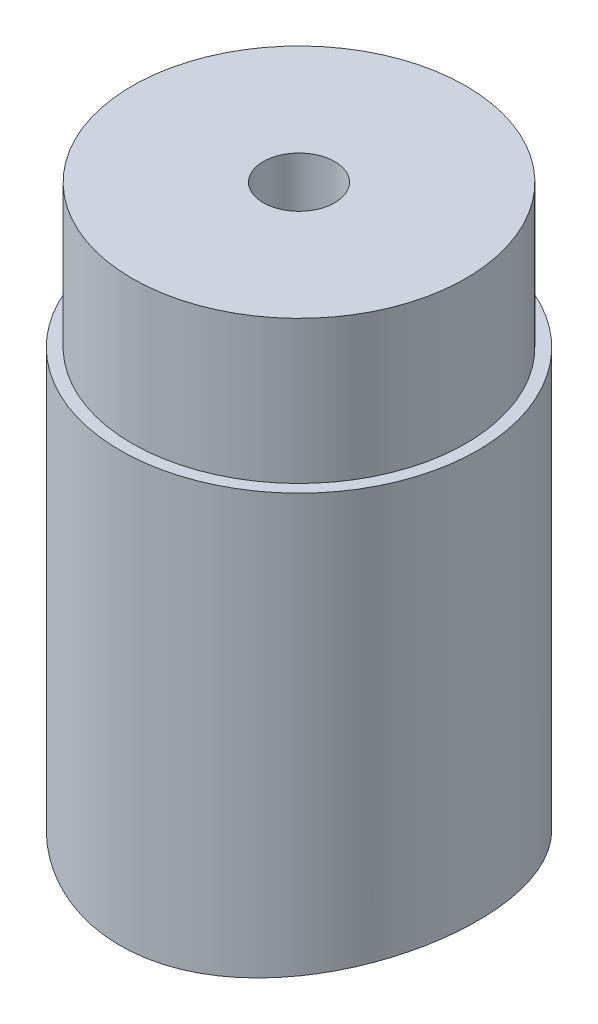
ISO-10303-21;
HEADER;
FILE_DESCRIPTION(('STEP AP214'),'2;1');
FILE_NAME('part.step','',(''),(''),'','','');
FILE_SCHEMA(('AUTOMOTIVE_DESIGN { 1 0 10303 214 1 1 1 1 }'));
ENDSEC;
DATA;
#1=APPLICATION_CONTEXT('core data for automotive mechanical design processes');
#2=APPLICATION_PROTOCOL_DEFINITION('international standard','automotive_design',2000,#1);
#3=PRODUCT_CONTEXT('',#1,'mechanical');
#4=PRODUCT('Part','Part','',(#3));
#5=PRODUCT_RELATED_PRODUCT_CATEGORY('part','',(#4));
#6=PRODUCT_DEFINITION_FORMATION('','',#4);
#7=PRODUCT_DEFINITION_CONTEXT('part definition',#1,'design');
#8=PRODUCT_DEFINITION('design','',#6,#7);
#9=PRODUCT_DEFINITION_SHAPE('','',#8);
#10=(LENGTH_UNIT() NAMED_UNIT(*) SI_UNIT(.MILLI.,.METRE.));
#11=(NAMED_UNIT(*) PLANE_ANGLE_UNIT() SI_UNIT($,.RADIAN.));
#12=(NAMED_UNIT(*) SI_UNIT($,.STERADIAN.) SOLID_ANGLE_UNIT());
#13=UNCERTAINTY_MEASURE_WITH_UNIT(LENGTH_MEASURE(1.E-05),#10,'distance_accuracy_value','');
#14=(GEOMETRIC_REPRESENTATION_CONTEXT(3) GLOBAL_UNCERTAINTY_ASSIGNED_CONTEXT((#13)) GLOBAL_UNIT_ASSIGNED_CONTEXT((#10,
#11,#12)) REPRESENTATION_CONTEXT('',''));
#15=CARTESIAN_POINT('',(0.,0.,0.));
#16=DIRECTION('',(0.,0.,1.));
#17=DIRECTION('',(1.,0.,0.));
#18=AXIS2_PLACEMENT_3D('',#15,#16,#17);
#19=CARTESIAN_POINT('',(0.,0.,0.));
#20=DIRECTION('',(0.,-1.,0.));
#21=DIRECTION('',(0.,0.,-1.));
#22=AXIS2_PLACEMENT_3D('',#19,#20,#21);
#23=CYLINDRICAL_SURFACE('',#22,7.5);
#24=CARTESIAN_POINT('',(0.,18.,0.));
#25=DIRECTION('',(0.,-1.,0.));
#26=DIRECTION('',(0.,0.,-1.));
#27=AXIS2_PLACEMENT_3D('',#24,#25,#26);
#28=CIRCLE('',#27,7.5);
#29=CARTESIAN_POINT('',(0.,18.,-7.5));
#30=VERTEX_POINT('',#29);
#31=EDGE_CURVE('E49',#30,#30,#28,.T.);
#32=ORIENTED_EDGE('',*,*,#31,.T.);
#33=EDGE_LOOP('',(#32));
#34=FACE_BOUND('',#33,.T.);
#35=CARTESIAN_POINT('',(0.,0.,-7.5));
#36=CARTESIAN_POINT('',(-0.207477785115257,-3.64191891598996E-06,-7.50000566186019));
#37=CARTESIAN_POINT('',(-0.414891882095582,0.00211419396957014,-7.4913890121041));
#38=CARTESIAN_POINT('',(-0.828268637635147,0.0105131409335911,-7.4570072869642));
#39=CARTESIAN_POINT('',(-1.03423110575467,0.0167947883520083,-7.43124000239579));
#40=CARTESIAN_POINT('',(-1.44322343414598,0.0333395847056984,-7.36275266417828));
#41=CARTESIAN_POINT('',(-1.64625217170755,0.0436042181146554,-7.32002628967709));
#42=CARTESIAN_POINT('',(-2.04794394191497,0.0678115764072696,-7.21795551927907));
#43=CARTESIAN_POINT('',(-2.24660533235433,0.0817556600488709,-7.15860498386536));
#44=CARTESIAN_POINT('',(-2.63779005019174,0.11288497250952,-7.02387300305222));
#45=CARTESIAN_POINT('',(-2.83032273184531,0.130064954754229,-6.94851748268615));
#46=CARTESIAN_POINT('',(-3.20836065900577,0.167192643123386,-6.78226191658269));
#47=CARTESIAN_POINT('',(-3.39386327605094,0.187141371704012,-6.69135612546898));
#48=CARTESIAN_POINT('',(-3.75648107964223,0.229230010794683,-6.49471893880397));
#49=CARTESIAN_POINT('',(-3.93359942613692,0.251369085905684,-6.38899318922691));
#50=CARTESIAN_POINT('',(-4.27845363073779,0.297240008490833,-6.16338445798656));
#51=CARTESIAN_POINT('',(-4.44618588090738,0.320972460838985,-6.04349608667571));
#52=CARTESIAN_POINT('',(-4.77399184226521,0.369801683375358,-5.7881705682849));
#53=CARTESIAN_POINT('',(-4.93387905336366,0.394915104552687,-5.65249710572271));
#54=CARTESIAN_POINT('',(-5.24178444793174,0.445425822222715,-5.36820488273269));
#55=CARTESIAN_POINT('',(-5.3897971824744,0.47082324301451,-5.2195802438278));
#56=CARTESIAN_POINT('',(-5.67290535825955,0.521191769574249,-4.91040556541588));
#57=CARTESIAN_POINT('',(-5.80799963001773,0.546162836577406,-4.74985444856034));
#58=CARTESIAN_POINT('',(-6.06428061193107,0.59497840344829,-4.41796764098414));
#59=CARTESIAN_POINT('',(-6.18547359231556,0.618823408352583,-4.24663686689864));
#60=CARTESIAN_POINT('',(-6.41466107866054,0.665043333420495,-3.89195107641934));
#61=CARTESIAN_POINT('',(-6.52246276501217,0.68739501578101,-3.70846834939846));
#62=CARTESIAN_POINT('',(-6.72214936764273,0.729640172398632,-3.33285606173632));
#63=CARTESIAN_POINT('',(-6.81404045305813,0.74953459856455,-3.14072988905045));
#64=CARTESIAN_POINT('',(-6.98126492036897,0.786313139820299,-2.74905360935766));
#65=CARTESIAN_POINT('',(-7.05659347490884,0.803196376991631,-2.54950135769078));
#66=CARTESIAN_POINT('',(-7.19001786741481,0.833452545681478,-2.14454436748292));
#67=CARTESIAN_POINT('',(-7.24812075177711,0.84682691229322,-1.93914205977979));
#68=CARTESIAN_POINT('',(-7.34575292944717,0.869478890351786,-1.52768153284583));
#69=CARTESIAN_POINT('',(-7.38559899075905,0.87882618838049,-1.3217022914384));
#70=CARTESIAN_POINT('',(-7.44789659490583,0.893503426888359,-0.907066139260536));
#71=CARTESIAN_POINT('',(-7.47035477492564,0.898834900239962,-0.698410281138459));
#72=CARTESIAN_POINT('',(-7.49771005652871,0.905334961265644,-0.279871478740145));
#73=CARTESIAN_POINT('',(-7.50260596334523,0.906503265718053,-0.0699884519520981));
#74=CARTESIAN_POINT('',(-7.49479089958357,0.904642827359901,0.349429565321617));
#75=CARTESIAN_POINT('',(-7.48208012629164,0.901614131577537,0.558964559680715));
#76=CARTESIAN_POINT('',(-7.43959945012264,0.891549919774782,0.971883807873502));
#77=CARTESIAN_POINT('',(-7.41018196026664,0.884597195837839,1.17530645667345));
#78=CARTESIAN_POINT('',(-7.3347829908426,0.86693342779052,1.57896451681188));
#79=CARTESIAN_POINT('',(-7.28879580112717,0.856221088097698,1.77919880452765));
#80=CARTESIAN_POINT('',(-7.18064332964315,0.831332368313959,2.17495486538368));
#81=CARTESIAN_POINT('',(-7.11848337580058,0.817157129128094,2.3704781673683));
#82=CARTESIAN_POINT('',(-6.97843163914662,0.785714868910288,2.75563020722558));
#83=CARTESIAN_POINT('',(-6.90053398126362,0.768446693522481,2.94525671315826));
#84=CARTESIAN_POINT('',(-6.72891412513431,0.731131796951332,3.31877928696629));
#85=CARTESIAN_POINT('',(-6.63507014858402,0.711063923826825,3.50261727454926));
#86=CARTESIAN_POINT('',(-6.43264395934715,0.668786045544397,3.86181400012339));
#87=CARTESIAN_POINT('',(-6.32405666662598,0.646575302794854,4.03716978707223));
#88=CARTESIAN_POINT('',(-6.09292729386158,0.600609093619677,4.37820360484536));
#89=CARTESIAN_POINT('',(-5.97038574846592,0.576853686391748,4.54388200608428));
#90=CARTESIAN_POINT('',(-5.71216379517052,0.528426771542574,4.86452041731091));
#91=CARTESIAN_POINT('',(-5.57648315192276,0.503755247516691,5.01948023522168));
#92=CARTESIAN_POINT('',(-5.28934526534162,0.453535090299676,5.32139974445308));
#93=CARTESIAN_POINT('',(-5.13758025465718,0.427979877116863,5.46806580123018));
#94=CARTESIAN_POINT('',(-4.82224579670998,0.377318969028385,5.74807725379765));
#95=CARTESIAN_POINT('',(-4.65868029731723,0.352213127260983,5.88142706928614));
#96=CARTESIAN_POINT('',(-4.32071360539229,0.303141827031746,6.13399989552071));
#97=CARTESIAN_POINT('',(-4.14630799088247,0.279176841089289,6.25321708276303));
#98=CARTESIAN_POINT('',(-3.78795351508951,0.233095522398997,6.47657059660718));
#99=CARTESIAN_POINT('',(-3.60400835242562,0.210978481733261,6.58071270952882));
#100=CARTESIAN_POINT('',(-3.22691699515853,0.169135883263908,6.77362964677407));
#101=CARTESIAN_POINT('',(-3.033733434208,0.149421427550947,6.86233388577524));
#102=CARTESIAN_POINT('',(-2.6403526375902,0.113099105639196,7.02308102545047));
#103=CARTESIAN_POINT('',(-2.44015802247562,0.0964900931132799,7.09513007646432));
#104=CARTESIAN_POINT('',(-2.03411820272436,0.0668783939054885,7.22202230313266));
#105=CARTESIAN_POINT('',(-1.82827282554762,0.0538758174772416,7.27686495277092));
#106=CARTESIAN_POINT('',(-1.41245881398335,0.0318840263401628,7.36887362337056));
#107=CARTESIAN_POINT('',(-1.20249027720173,0.0228947167461667,7.40604006224973));
#108=CARTESIAN_POINT('',(-0.785098221172142,0.00937816130874734,7.4616940672274));
#109=CARTESIAN_POINT('',(-0.577734961689319,0.00474879101166943,7.48060941025187));
#110=CARTESIAN_POINT('',(-0.162103538662051,-0.000276190805497028,7.50113411289833));
#111=CARTESIAN_POINT('',(0.046164611284293,-0.000671865728161006,7.50274373168575));
#112=CARTESIAN_POINT('',(0.462061324902458,0.00278247695185561,7.48864400921097));
#113=CARTESIAN_POINT('',(0.669689936620102,0.00663216741142223,7.47293600242568));
#114=CARTESIAN_POINT('',(1.08280607293679,0.0184593614008355,7.42433749766455));
#115=CARTESIAN_POINT('',(1.28829360553846,0.0264368494967186,7.39144706393432));
#116=CARTESIAN_POINT('',(1.69264243825305,0.0461318791154691,7.30937024678969));
#117=CARTESIAN_POINT('',(1.89155675573342,0.0577926113128277,7.26043098449427));
#118=CARTESIAN_POINT('',(2.28457128615644,0.0845532441935697,7.1465102100412));
#119=CARTESIAN_POINT('',(2.47866984346582,0.0996543099643883,7.08152326262178));
#120=CARTESIAN_POINT('',(2.86063190806128,0.132858375250179,6.936032045251));
#121=CARTESIAN_POINT('',(3.04849709261002,0.150960559238872,6.85553198988168));
#122=CARTESIAN_POINT('',(3.41689383771736,0.189670697678792,6.67956018287685));
#123=CARTESIAN_POINT('',(3.59742261866015,0.210279590278016,6.58408282201468));
#124=CARTESIAN_POINT('',(3.9530327319302,0.253812774936,6.37703737994507));
#125=CARTESIAN_POINT('',(4.12796208876897,0.276771458426482,6.26521548326117));
#126=CARTESIAN_POINT('',(4.46788935077487,0.32406025557219,6.02751968981976));
#127=CARTESIAN_POINT('',(4.63288378146608,0.348390843319935,5.90164092047534));
#128=CARTESIAN_POINT('',(4.95181290412295,0.397746796299397,5.6367120575443));
#129=CARTESIAN_POINT('',(5.10574801084992,0.422772135426782,5.49766245836138));
#130=CARTESIAN_POINT('',(5.40157585984315,0.472839063418635,5.20729644283879));
#131=CARTESIAN_POINT('',(5.54346849576263,0.497880652424637,5.05597991819326));
#132=CARTESIAN_POINT('',(5.8173579726132,0.547866004405278,4.73849015208496));
#133=CARTESIAN_POINT('',(5.94905743440285,0.572794671099067,4.57205781665316));
#134=CARTESIAN_POINT('',(6.19792424296854,0.621253617414327,4.22855785128825));
#135=CARTESIAN_POINT('',(6.31509659442498,0.644784377160294,4.05149391538568));
#136=CARTESIAN_POINT('',(6.53414980636014,0.689802358218292,3.68781270322675));
#137=CARTESIAN_POINT('',(6.63602541048455,0.711288876151493,3.50119217248619));
#138=CARTESIAN_POINT('',(6.82362728259856,0.751592278996032,3.11981601281419));
#139=CARTESIAN_POINT('',(6.90935997442357,0.770410225087376,2.92506365767667));
#140=CARTESIAN_POINT('',(7.06353369269718,0.804734721179386,2.53004812628756));
#141=CARTESIAN_POINT('',(7.13208589923871,0.820262456344145,2.3298302003203));
#142=CARTESIAN_POINT('',(7.2520558657062,0.847716552485254,1.92416388684225));
#143=CARTESIAN_POINT('',(7.30348014676503,0.859644283932093,1.71871752210235));
#144=CARTESIAN_POINT('',(7.38879923142866,0.879564480086534,1.30401744375156));
#145=CARTESIAN_POINT('',(7.42269325741099,0.887556770221614,1.0947635616696));
#146=CARTESIAN_POINT('',(7.47265482913323,0.899373970136546,0.674022853015286));
#147=CARTESIAN_POINT('',(7.48872272489774,0.903198961743271,0.462536070369318));
#148=CARTESIAN_POINT('',(7.5027170854461,0.9065292820428,0.0441786826822124));
#149=CARTESIAN_POINT('',(7.50108302013739,0.906139253656881,-0.162676518518609));
#150=CARTESIAN_POINT('',(7.48073901135323,0.901300969516393,-0.575570473421955));
#151=CARTESIAN_POINT('',(7.46202316380301,0.896851310608546,-0.781608920093625));
#152=CARTESIAN_POINT('',(7.40767400945618,0.884017219815679,-1.19123318751819));
#153=CARTESIAN_POINT('',(7.37204739019108,0.875634343375425,-1.39481994521072));
#154=CARTESIAN_POINT('',(7.28415473845745,0.855160895095519,-1.79825681089151));
#155=CARTESIAN_POINT('',(7.23188253034816,0.843068947223285,-1.99810550284731));
#156=CARTESIAN_POINT('',(7.11141287681519,0.815575276912364,-2.39164139756528));
#157=CARTESIAN_POINT('',(7.04329389156758,0.800189889895415,-2.58535378086215));
#158=CARTESIAN_POINT('',(6.89148804912021,0.766481314914099,-2.96638939322465));
#159=CARTESIAN_POINT('',(6.80779585945846,0.74815712096281,-3.15371040772784));
#160=CARTESIAN_POINT('',(6.62548078825301,0.709062832981946,-3.52064937481166));
#161=CARTESIAN_POINT('',(6.52685925332553,0.688292959588399,-3.70026802026719));
#162=CARTESIAN_POINT('',(6.31537185157883,0.644852418652756,-4.05067387400211));
#163=CARTESIAN_POINT('',(6.20250563933414,0.622181705020823,-4.22146086797727));
#164=CARTESIAN_POINT('',(5.96063267102081,0.575014537961751,-4.55681271089479));
#165=CARTESIAN_POINT('',(5.83132306422594,0.550488714692936,-4.72115506443738));
#166=CARTESIAN_POINT('',(5.5595425723369,0.500748681222312,-5.03836234439655));
#167=CARTESIAN_POINT('',(5.41707592807594,0.475534694665478,-5.19123094048473));
#168=CARTESIAN_POINT('',(5.11980145276449,0.425085093143723,-5.48463975354075));
#169=CARTESIAN_POINT('',(4.96498638556468,0.399849474197998,-5.62517263898709));
#170=CARTESIAN_POINT('',(4.64415950140659,0.350076528071892,-5.89282698455559));
#171=CARTESIAN_POINT('',(4.4781517638724,0.325538951061312,-6.01995328815694));
#172=CARTESIAN_POINT('',(4.13307044053754,0.277432894251753,-6.2620198647212));
#173=CARTESIAN_POINT('',(3.95382333787007,0.253887828736196,-6.3767176252994));
#174=CARTESIAN_POINT('',(3.58610154109881,0.208915851644607,-6.59053084239048));
#175=CARTESIAN_POINT('',(3.39763027543108,0.187488161889283,-6.68965203158051));
#176=CARTESIAN_POINT('',(3.01278284670147,0.147390375519019,-6.87156486174211));
#177=CARTESIAN_POINT('',(2.81641057490498,0.12871894209359,-6.95436442543513));
#178=CARTESIAN_POINT('',(2.41714290867448,0.0946914101940961,-7.10301505742704));
#179=CARTESIAN_POINT('',(2.21424858529943,0.0793347705241236,-7.1688688927393));
#180=CARTESIAN_POINT('',(1.68270395676214,0.0445179994820043,-7.31661746292798));
#181=CARTESIAN_POINT('',(1.35008096100214,0.0279324844565769,-7.38527246298968));
#182=CARTESIAN_POINT('',(0.67824831732328,0.00567683745182493,-7.47695752923628));
#183=CARTESIAN_POINT('',(0.339039126157454,5.95125403969208E-06,-7.49999074796307));
#184=CARTESIAN_POINT('',(0.,0.,-7.5));
#185=B_SPLINE_CURVE_WITH_KNOTS('',3,(#35,#36,#37,#38,#39,#40,#41,#42,#43,#44,#45,#46,#47,#48,
#49,#50,#51,#52,#53,#54,#55,#56,#57,#58,#59,#60,#61,#62,#63,#64,#65,#66,#67,#68,#69,#70,#71,#72,
#73,#74,#75,#76,#77,#78,#79,#80,#81,#82,#83,#84,#85,#86,#87,#88,#89,#90,#91,#92,#93,#94,#95,#96,
#97,#98,#99,#100,#101,#102,#103,#104,#105,#106,#107,#108,#109,#110,#111,#112,#113,#114,#115,
#116,#117,#118,#119,#120,#121,#122,#123,#124,#125,#126,#127,#128,#129,#130,#131,#132,#133,#134,
#135,#136,#137,#138,#139,#140,#141,#142,#143,#144,#145,#146,#147,#148,#149,#150,#151,#152,#153,
#154,#155,#156,#157,#158,#159,#160,#161,#162,#163,#164,#165,#166,#167,#168,#169,#170,#171,#172,
#173,#174,#175,#176,#177,#178,#179,#180,#181,#182,#183,#184),.UNSPECIFIED.,.T.,.F.,(4,2,2,2,2,2,
2,2,2,2,2,2,2,2,2,2,2,2,2,2,2,2,2,2,2,2,2,2,2,2,2,2,2,2,2,2,2,2,2,2,2,2,2,2,2,2,2,2,2,2,2,2,2,2,
2,2,2,2,2,2,2,2,2,2,2,2,2,2,2,2,2,2,2,2,4),(0.,0.62213423477283,1.24434862257992,
1.86679513508979,2.48947182890104,3.11114749390711,3.73305334821232,4.35472291512948,
4.97662982789591,5.60947097663692,6.24260088023941,6.87578804575614,7.50868847732104,
8.14984594047,8.79075424340086,9.43184910012715,10.0726813452269,10.7019292682108,
11.3309368803348,11.9599872832248,12.5890306375405,13.2052731057297,13.8217281430168,
14.4379803530554,15.0544630438668,15.6758846769775,16.2975209763735,16.9191334662119,
17.5407570924578,18.1777940090673,18.8146187836316,19.4517050633184,20.0885461557692,
20.7282266083798,21.3676704644759,22.0071338670812,22.6465821501327,23.27064991524,
23.8947083344792,24.5187186678338,25.1427266680112,25.7575450020631,26.3725718579691,
26.9874318590994,27.602522686771,28.2284484813839,28.8545919204837,29.4807118648571,
30.1068373379057,30.7471616282004,31.387264706155,32.0275872390142,32.6676544238957,
33.3034658819706,33.9390349894352,34.5746322876157,35.2102171053182,35.8300597634955,
36.4501167426264,37.0699287181387,37.6899709170749,38.3070061678535,38.9242530893939,
39.5414443688423,40.1586506177106,40.7895674778439,41.4202816832029,42.0513682400808,
42.6822260136484,43.3237552305484,43.965047788393,44.6060282840684,45.2469040495943,
46.2636028936565,47.2802314796656),.UNSPECIFIED.);
#186=CARTESIAN_POINT('',(0.,0.,-7.5));
#187=VERTEX_POINT('',#186);
#188=EDGE_CURVE('E57',#187,#187,#185,.T.);
#189=ORIENTED_EDGE('',*,*,#188,.T.);
#190=EDGE_LOOP('',(#189));
#191=FACE_BOUND('',#190,.T.);
#192=ADVANCED_FACE('F32',(#34,#191),#23,.T.);
#193=CARTESIAN_POINT('',(0.,0.,0.));
#194=DIRECTION('',(0.,-1.,0.));
#195=DIRECTION('',(0.,0.,-1.));
#196=AXIS2_PLACEMENT_3D('',#193,#194,#195);
#197=CYLINDRICAL_SURFACE('',#196,1.5);
#198=CARTESIAN_POINT('',(0.,24.,0.));
#199=DIRECTION('',(0.,-1.,0.));
#200=DIRECTION('',(0.,0.,-1.));
#201=AXIS2_PLACEMENT_3D('',#198,#199,#200);
#202=CIRCLE('',#201,1.5);
#203=CARTESIAN_POINT('',(0.,24.,-1.5));
#204=VERTEX_POINT('',#203);
#205=EDGE_CURVE('E54',#204,#204,#202,.T.);
#206=ORIENTED_EDGE('',*,*,#205,.F.);
#207=EDGE_LOOP('',(#206));
#208=FACE_BOUND('',#207,.T.);
#209=CARTESIAN_POINT('',(0.,0.870148363547839,-1.5));
#210=CARTESIAN_POINT('',(0.084204394809224,0.870148843893728,-1.4999962819843));
#211=CARTESIAN_POINT('',(0.168468629842511,0.870490016997417,-1.49288580772617));
#212=CARTESIAN_POINT('',(0.334672901678346,0.871818098042145,-1.46462135660692));
#213=CARTESIAN_POINT('',(0.416610075269901,0.872805768325775,-1.44345079981493));
#214=CARTESIAN_POINT('',(0.575728514243859,0.875314712562987,-1.3876733812731));
#215=CARTESIAN_POINT('',(0.652912166923482,0.876835716055845,-1.35307332885906));
#216=CARTESIAN_POINT('',(0.80035490999122,0.88023959819999,-1.27142944366272));
#217=CARTESIAN_POINT('',(0.870615637581478,0.88212239097952,-1.22438856275273));
#218=CARTESIAN_POINT('',(1.00230455668159,0.886039705845576,-1.11914935031099));
#219=CARTESIAN_POINT('',(1.06372551905087,0.888074350074277,-1.06094197657492));
#220=CARTESIAN_POINT('',(1.17592982220452,0.892064945666554,-0.935039975349695));
#221=CARTESIAN_POINT('',(1.22671273032763,0.894020893826861,-0.86734496217471));
#222=CARTESIAN_POINT('',(1.31621858847388,0.89763458796702,-0.724352342353873));
#223=CARTESIAN_POINT('',(1.35493601439227,0.899292197207991,-0.649051274154092));
#224=CARTESIAN_POINT('',(1.41917637733429,0.902121198332273,-0.493008460741813));
#225=CARTESIAN_POINT('',(1.44469940738248,0.90329259364353,-0.412266753892033));
#226=CARTESIAN_POINT('',(1.48180767026685,0.905016352217802,-0.247700160924788));
#227=CARTESIAN_POINT('',(1.49340356235629,0.905569188877735,-0.163877683408344));
#228=CARTESIAN_POINT('',(1.50236127495515,0.905995115627127,0.00452574733751399));
#229=CARTESIAN_POINT('',(1.49972319946371,0.905868210683054,0.0891066950207282));
#230=CARTESIAN_POINT('',(1.48029672073123,0.90494935495077,0.256553947501497));
#231=CARTESIAN_POINT('',(1.46351979303651,0.904157943499292,0.339421587009218));
#232=CARTESIAN_POINT('',(1.41630963023021,0.90199984622699,0.501163026749449));
#233=CARTESIAN_POINT('',(1.3858763417857,0.900633158159508,0.580036811383206));
#234=CARTESIAN_POINT('',(1.31220424921885,0.897477539187338,0.73158856411948));
#235=CARTESIAN_POINT('',(1.2689602120351,0.895688435791002,0.804263984597825));
#236=CARTESIAN_POINT('',(1.17089798873575,0.891889488304861,0.94132816711818));
#237=CARTESIAN_POINT('',(1.11607972891008,0.889879642809307,1.00571687638233));
#238=CARTESIAN_POINT('',(0.996360264682104,0.885863218564164,1.12444679816206));
#239=CARTESIAN_POINT('',(0.931449104564673,0.883856645038373,1.17877797267067));
#240=CARTESIAN_POINT('',(0.793421422026242,0.880074987320255,1.27577324221527));
#241=CARTESIAN_POINT('',(0.720304897572143,0.878299903185286,1.31843733436041));
#242=CARTESIAN_POINT('',(0.567935994531881,0.875181548994742,1.39088645653523));
#243=CARTESIAN_POINT('',(0.488683439777031,0.873838291342844,1.42067111662778));
#244=CARTESIAN_POINT('',(0.326294873676328,0.871735547775308,1.46650922907323));
#245=CARTESIAN_POINT('',(0.243158888829025,0.870976057876953,1.48256277510584));
#246=CARTESIAN_POINT('',(0.0754508132442197,0.870127230885332,1.50047055768549));
#247=CARTESIAN_POINT('',(-0.00911978701157072,0.870037236411118,1.50233872296706));
#248=CARTESIAN_POINT('',(-0.177373285452335,0.870535832755004,1.49185905505683));
#249=CARTESIAN_POINT('',(-0.261056186294589,0.871124421541223,1.47951126443184));
#250=CARTESIAN_POINT('',(-0.425119749539236,0.872913243217516,1.44096174289239));
#251=CARTESIAN_POINT('',(-0.505501911723215,0.874113194919212,1.41476638077946));
#252=CARTESIAN_POINT('',(-0.660728424727574,0.876989254349454,1.34927175252168));
#253=CARTESIAN_POINT('',(-0.735572746520304,0.878665364573654,1.30997241769578));
#254=CARTESIAN_POINT('',(-0.877663117366537,0.882306423915497,1.21934963609518));
#255=CARTESIAN_POINT('',(-0.944903190916496,0.884271597430737,1.1680168292819));
#256=CARTESIAN_POINT('',(-1.0698162713297,0.888268492296514,1.05479793773025));
#257=CARTESIAN_POINT('',(-1.12748922237888,0.890300214035206,0.99291179142855));
#258=CARTESIAN_POINT('',(-1.23167769705715,0.894203125191629,0.86028313914203));
#259=CARTESIAN_POINT('',(-1.27818422609202,0.896074184421069,0.789533562968178));
#260=CARTESIAN_POINT('',(-1.35865822265186,0.89944303408754,0.641222146614338));
#261=CARTESIAN_POINT('',(-1.39262574095431,0.900940826036132,0.563660334022489));
#262=CARTESIAN_POINT('',(-1.44704176394667,0.903393711791077,0.403959665221762));
#263=CARTESIAN_POINT('',(-1.46749603314575,0.904349036979533,0.321822776892657));
#264=CARTESIAN_POINT('',(-1.49432381681445,0.905610240861682,0.155275930276677));
#265=CARTESIAN_POINT('',(-1.50069740097249,0.905916122769615,0.0708659832417643));
#266=CARTESIAN_POINT('',(-1.4991822149771,0.90584398165408,-0.097741560534615));
#267=CARTESIAN_POINT('',(-1.49130756013566,0.905466635484354,-0.181939284778483));
#268=CARTESIAN_POINT('',(-1.46154859090086,0.904071856068594,-0.347815895739697));
#269=CARTESIAN_POINT('',(-1.43966424987962,0.903054421605959,-0.429494777669229));
#270=CARTESIAN_POINT('',(-1.38250994265639,0.900493952156938,-0.588018282190981));
#271=CARTESIAN_POINT('',(-1.34723985364606,0.898950912348369,-0.664862860423051));
#272=CARTESIAN_POINT('',(-1.26431783178765,0.895512814892539,-0.811540355389434));
#273=CARTESIAN_POINT('',(-1.21666628881811,0.893617768330125,-0.881373492810437));
#274=CARTESIAN_POINT('',(-1.11028399437721,0.889686858967644,-1.01211598053397));
#275=CARTESIAN_POINT('',(-1.05154351257538,0.887650873497648,-1.07301740940291));
#276=CARTESIAN_POINT('',(-0.924655100308069,0.883668336669329,-1.18411330066078));
#277=CARTESIAN_POINT('',(-0.856504856708794,0.881721807458692,-1.23430512263852));
#278=CARTESIAN_POINT('',(-0.712681791724394,0.878136508387453,-1.32257838546133));
#279=CARTESIAN_POINT('',(-0.637002151594976,0.876498021446729,-1.36064871542098));
#280=CARTESIAN_POINT('',(-0.480374331342325,0.873718147589298,-1.42349744158666));
#281=CARTESIAN_POINT('',(-0.399432510833651,0.872576172993389,-1.44829155980584));
#282=CARTESIAN_POINT('',(-0.264988792452621,0.871220889874034,-1.4773706977556));
#283=CARTESIAN_POINT('',(-0.212357992745769,0.870820462431029,-1.48584587476205));
#284=CARTESIAN_POINT('',(-0.106492774590438,0.870284047463279,-1.49716169951079));
#285=CARTESIAN_POINT('',(-0.0532583566081141,0.87014805973433,-1.50000235160417));
#286=CARTESIAN_POINT('',(0.,0.870148363547839,-1.5));
#287=B_SPLINE_CURVE_WITH_KNOTS('',3,(#209,#210,#211,#212,#213,#214,#215,#216,#217,#218,#219,
#220,#221,#222,#223,#224,#225,#226,#227,#228,#229,#230,#231,#232,#233,#234,#235,#236,#237,#238,
#239,#240,#241,#242,#243,#244,#245,#246,#247,#248,#249,#250,#251,#252,#253,#254,#255,#256,#257,
#258,#259,#260,#261,#262,#263,#264,#265,#266,#267,#268,#269,#270,#271,#272,#273,#274,#275,#276,
#277,#278,#279,#280,#281,#282,#283,#284,#285,#286),.UNSPECIFIED.,.T.,.F.,(4,2,2,2,2,2,2,2,2,2,2,
2,2,2,2,2,2,2,2,2,2,2,2,2,2,2,2,2,2,2,2,2,2,2,2,2,2,2,4),(0.,0.25241877291402,0.505135732869887,
0.757724721427066,1.01025383113121,1.26298829917882,1.51573304421801,1.76859333740449,
2.02145184782355,2.27411670725812,2.5267797206231,2.77923786185179,3.03169698902736,
3.28425938574244,3.53682339094164,3.78963812647859,4.04245292465732,4.29527498397667,
4.54809531841897,4.80066737448786,5.05323867428271,5.30569391193885,5.55815047279371,
5.81080405825838,6.06345911763839,6.31631701393422,6.56917388625546,6.82192282461286,
7.0746705120571,7.32716794686794,7.57966586159613,7.83216609293751,8.08465837428378,
8.33737325135336,8.59015036246668,8.84315851324808,9.09586637923701,9.25551860919665,
9.41517071586989),.UNSPECIFIED.);
#288=CARTESIAN_POINT('',(0.,0.870148363547839,-1.5));
#289=VERTEX_POINT('',#288);
#290=EDGE_CURVE('E36',#289,#289,#287,.T.);
#291=ORIENTED_EDGE('',*,*,#290,.T.);
#292=EDGE_LOOP('',(#291));
#293=FACE_BOUND('',#292,.T.);
#294=ADVANCED_FACE('F70',(#208,#293),#197,.F.);
#295=CARTESIAN_POINT('',(1.5,24.,0.));
#296=DIRECTION('',(0.,1.,0.));
#297=DIRECTION('',(0.,0.,1.));
#298=AXIS2_PLACEMENT_3D('',#295,#296,#297);
#299=PLANE('',#298);
#300=ORIENTED_EDGE('',*,*,#205,.T.);
#301=EDGE_LOOP('',(#300));
#302=FACE_BOUND('',#301,.T.);
#303=CARTESIAN_POINT('',(0.,24.,0.));
#304=DIRECTION('',(0.,-1.,0.));
#305=DIRECTION('',(0.,0.,-1.));
#306=AXIS2_PLACEMENT_3D('',#303,#304,#305);
#307=CIRCLE('',#306,7.);
#308=CARTESIAN_POINT('',(0.,24.,-7.));
#309=VERTEX_POINT('',#308);
#310=EDGE_CURVE('E10',#309,#309,#307,.T.);
#311=ORIENTED_EDGE('',*,*,#310,.F.);
#312=EDGE_LOOP('',(#311));
#313=FACE_BOUND('',#312,.T.);
#314=ADVANCED_FACE('F34',(#302,#313),#299,.T.);
#315=CARTESIAN_POINT('',(0.,0.,0.));
#316=DIRECTION('',(0.,-1.,0.));
#317=DIRECTION('',(0.,0.,-1.));
#318=AXIS2_PLACEMENT_3D('',#315,#316,#317);
#319=CYLINDRICAL_SURFACE('',#318,7.);
#320=ORIENTED_EDGE('',*,*,#310,.T.);
#321=EDGE_LOOP('',(#320));
#322=FACE_BOUND('',#321,.T.);
#323=CARTESIAN_POINT('',(0.,18.,0.));
#324=DIRECTION('',(0.,-1.,0.));
#325=DIRECTION('',(0.,0.,-1.));
#326=AXIS2_PLACEMENT_3D('',#323,#324,#325);
#327=CIRCLE('',#326,7.);
#328=CARTESIAN_POINT('',(0.,18.,-7.));
#329=VERTEX_POINT('',#328);
#330=EDGE_CURVE('E45',#329,#329,#327,.T.);
#331=ORIENTED_EDGE('',*,*,#330,.F.);
#332=EDGE_LOOP('',(#331));
#333=FACE_BOUND('',#332,.T.);
#334=ADVANCED_FACE('F79',(#322,#333),#319,.T.);
#335=CARTESIAN_POINT('',(7.,18.,0.));
#336=DIRECTION('',(0.,1.,0.));
#337=DIRECTION('',(0.,0.,1.));
#338=AXIS2_PLACEMENT_3D('',#335,#336,#337);
#339=PLANE('',#338);
#340=ORIENTED_EDGE('',*,*,#330,.T.);
#341=EDGE_LOOP('',(#340));
#342=FACE_BOUND('',#341,.T.);
#343=ORIENTED_EDGE('',*,*,#31,.F.);
#344=EDGE_LOOP('',(#343));
#345=FACE_BOUND('',#344,.T.);
#346=ADVANCED_FACE('F68',(#342,#345),#339,.T.);
#347=CARTESIAN_POINT('',(-7.5,-30.5941170815567,0.));
#348=DIRECTION('',(1.,0.,0.));
#349=DIRECTION('',(0.,0.,-1.));
#350=AXIS2_PLACEMENT_3D('',#347,#348,#349);
#351=CYLINDRICAL_SURFACE('',#350,31.5);
#352=ORIENTED_EDGE('',*,*,#290,.F.);
#353=EDGE_LOOP('',(#352));
#354=FACE_BOUND('',#353,.T.);
#355=ORIENTED_EDGE('',*,*,#188,.F.);
#356=EDGE_LOOP('',(#355));
#357=FACE_BOUND('',#356,.T.);
#358=ADVANCED_FACE('F65',(#354,#357),#351,.F.);
#359=CLOSED_SHELL('',(#192,#294,#314,#334,#346,#358));
#360=MANIFOLD_SOLID_BREP('B2',#359);
#361=ADVANCED_BREP_SHAPE_REPRESENTATION('',(#18,#360),#14);
#362=SHAPE_DEFINITION_REPRESENTATION(#9,#361);
ENDSEC;
END-ISO-10303-21;
